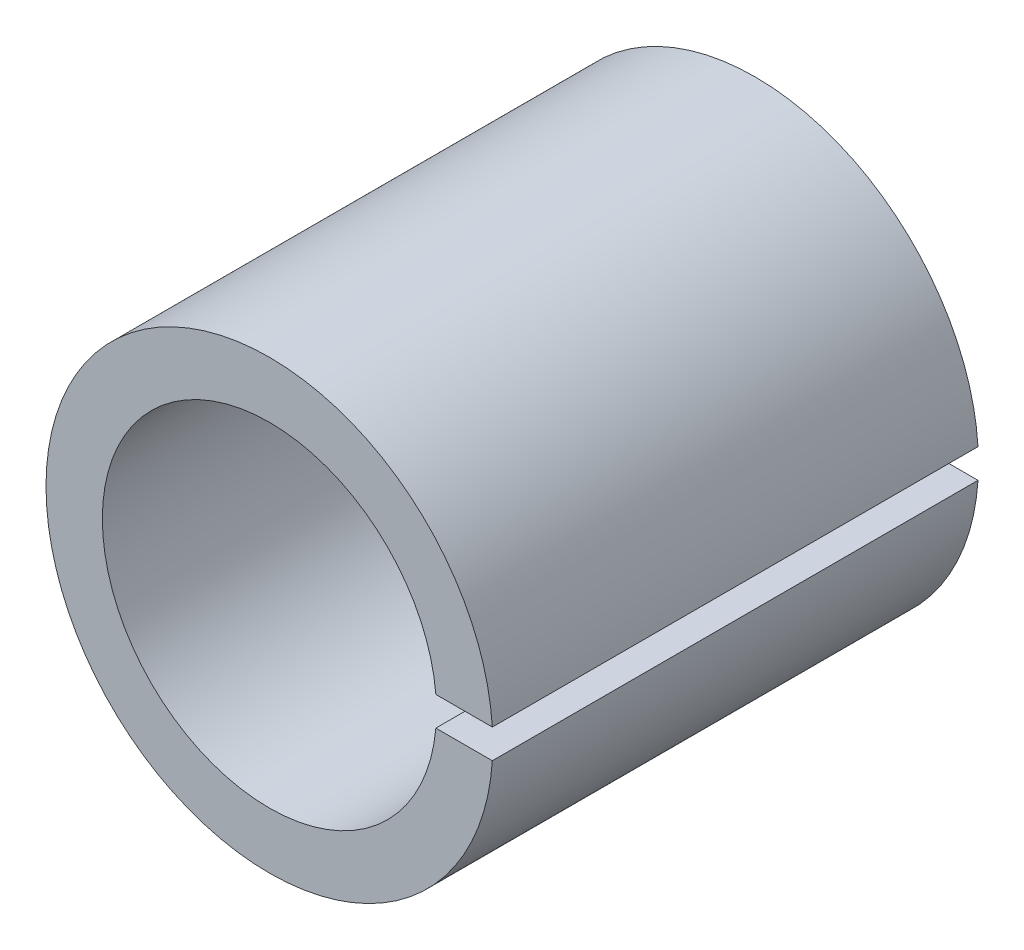
ISO-10303-21;
HEADER;
FILE_DESCRIPTION(('STEP AP214'),'2;1');
FILE_NAME('part.step','',(''),(''),'','','');
FILE_SCHEMA(('AUTOMOTIVE_DESIGN { 1 0 10303 214 1 1 1 1 }'));
ENDSEC;
DATA;
#1=APPLICATION_CONTEXT('core data for automotive mechanical design processes');
#2=APPLICATION_PROTOCOL_DEFINITION('international standard','automotive_design',2000,#1);
#3=PRODUCT_CONTEXT('',#1,'mechanical');
#4=PRODUCT('Part','Part','',(#3));
#5=PRODUCT_RELATED_PRODUCT_CATEGORY('part','',(#4));
#6=PRODUCT_DEFINITION_FORMATION('','',#4);
#7=PRODUCT_DEFINITION_CONTEXT('part definition',#1,'design');
#8=PRODUCT_DEFINITION('design','',#6,#7);
#9=PRODUCT_DEFINITION_SHAPE('','',#8);
#10=(LENGTH_UNIT() NAMED_UNIT(*) SI_UNIT(.MILLI.,.METRE.));
#11=(NAMED_UNIT(*) PLANE_ANGLE_UNIT() SI_UNIT($,.RADIAN.));
#12=(NAMED_UNIT(*) SI_UNIT($,.STERADIAN.) SOLID_ANGLE_UNIT());
#13=UNCERTAINTY_MEASURE_WITH_UNIT(LENGTH_MEASURE(1.E-05),#10,'distance_accuracy_value','');
#14=(GEOMETRIC_REPRESENTATION_CONTEXT(3) GLOBAL_UNCERTAINTY_ASSIGNED_CONTEXT((#13)) GLOBAL_UNIT_ASSIGNED_CONTEXT((#10,
#11,#12)) REPRESENTATION_CONTEXT('',''));
#15=CARTESIAN_POINT('',(0.,0.,0.));
#16=DIRECTION('',(0.,0.,1.));
#17=DIRECTION('',(1.,0.,0.));
#18=AXIS2_PLACEMENT_3D('',#15,#16,#17);
#19=CARTESIAN_POINT('',(0.,0.,3.175));
#20=DIRECTION('',(0.,0.,-1.));
#21=DIRECTION('',(-1.,0.,0.));
#22=AXIS2_PLACEMENT_3D('',#19,#20,#21);
#23=CYLINDRICAL_SURFACE('',#22,2.921);
#24=DIRECTION('',(0.,0.,-1.));
#25=VECTOR('',#24,1.);
#26=CARTESIAN_POINT('',(2.91478142405224,0.1905,3.175));
#27=LINE('',#26,#25);
#28=CARTESIAN_POINT('',(2.91478142405224,0.1905,3.175));
#29=VERTEX_POINT('',#28);
#30=CARTESIAN_POINT('',(2.91478142405224,0.1905,-3.175));
#31=VERTEX_POINT('',#30);
#32=EDGE_CURVE('E91',#29,#31,#27,.T.);
#33=ORIENTED_EDGE('',*,*,#32,.T.);
#34=CARTESIAN_POINT('',(0.,0.,-3.175));
#35=DIRECTION('',(0.,0.,1.));
#36=DIRECTION('',(1.,0.,0.));
#37=AXIS2_PLACEMENT_3D('',#34,#35,#36);
#38=CIRCLE('',#37,2.921);
#39=CARTESIAN_POINT('',(2.91478142405224,-0.1905,-3.175));
#40=VERTEX_POINT('',#39);
#41=EDGE_CURVE('E86',#31,#40,#38,.T.);
#42=ORIENTED_EDGE('',*,*,#41,.T.);
#43=DIRECTION('',(0.,0.,-1.));
#44=VECTOR('',#43,1.);
#45=CARTESIAN_POINT('',(2.91478142405224,-0.1905,3.175));
#46=LINE('',#45,#44);
#47=CARTESIAN_POINT('',(2.91478142405224,-0.1905,3.175));
#48=VERTEX_POINT('',#47);
#49=EDGE_CURVE('E11',#48,#40,#46,.T.);
#50=ORIENTED_EDGE('',*,*,#49,.F.);
#51=CARTESIAN_POINT('',(0.,0.,3.175));
#52=DIRECTION('',(0.,0.,1.));
#53=DIRECTION('',(1.,0.,0.));
#54=AXIS2_PLACEMENT_3D('',#51,#52,#53);
#55=CIRCLE('',#54,2.921);
#56=EDGE_CURVE('E97',#29,#48,#55,.T.);
#57=ORIENTED_EDGE('',*,*,#56,.F.);
#58=EDGE_LOOP('',(#33,#42,#50,#57));
#59=FACE_BOUND('',#58,.T.);
#60=ADVANCED_FACE('F34',(#59),#23,.T.);
#61=CARTESIAN_POINT('',(2.17607745955883,-0.1905,3.175));
#62=DIRECTION('',(0.,-1.,0.));
#63=DIRECTION('',(0.,0.,-1.));
#64=AXIS2_PLACEMENT_3D('',#61,#62,#63);
#65=PLANE('',#64);
#66=ORIENTED_EDGE('',*,*,#49,.T.);
#67=DIRECTION('',(-1.,0.,0.));
#68=VECTOR('',#67,1.);
#69=CARTESIAN_POINT('',(2.17607745955883,-0.1905,-3.175));
#70=LINE('',#69,#68);
#71=CARTESIAN_POINT('',(2.17607745955883,-0.1905,-3.175));
#72=VERTEX_POINT('',#71);
#73=EDGE_CURVE('E76',#40,#72,#70,.T.);
#74=ORIENTED_EDGE('',*,*,#73,.T.);
#75=DIRECTION('',(0.,0.,-1.));
#76=VECTOR('',#75,1.);
#77=CARTESIAN_POINT('',(2.17607745955883,-0.1905,3.175));
#78=LINE('',#77,#76);
#79=CARTESIAN_POINT('',(2.17607745955883,-0.1905,3.175));
#80=VERTEX_POINT('',#79);
#81=EDGE_CURVE('E41',#80,#72,#78,.T.);
#82=ORIENTED_EDGE('',*,*,#81,.F.);
#83=DIRECTION('',(-1.,0.,0.));
#84=VECTOR('',#83,1.);
#85=CARTESIAN_POINT('',(2.17607745955883,-0.1905,3.175));
#86=LINE('',#85,#84);
#87=EDGE_CURVE('E77',#48,#80,#86,.T.);
#88=ORIENTED_EDGE('',*,*,#87,.F.);
#89=EDGE_LOOP('',(#66,#74,#82,#88));
#90=FACE_BOUND('',#89,.T.);
#91=ADVANCED_FACE('F74',(#90),#65,.F.);
#92=CARTESIAN_POINT('',(0.,0.,3.175));
#93=DIRECTION('',(0.,0.,-1.));
#94=DIRECTION('',(-1.,0.,0.));
#95=AXIS2_PLACEMENT_3D('',#92,#93,#94);
#96=CYLINDRICAL_SURFACE('',#95,2.1844);
#97=ORIENTED_EDGE('',*,*,#81,.T.);
#98=CARTESIAN_POINT('',(0.,0.,-3.175));
#99=DIRECTION('',(0.,0.,-1.));
#100=DIRECTION('',(1.,0.,0.));
#101=AXIS2_PLACEMENT_3D('',#98,#99,#100);
#102=CIRCLE('',#101,2.1844);
#103=CARTESIAN_POINT('',(2.17607745955883,0.1905,-3.175));
#104=VERTEX_POINT('',#103);
#105=EDGE_CURVE('E89',#72,#104,#102,.T.);
#106=ORIENTED_EDGE('',*,*,#105,.T.);
#107=DIRECTION('',(0.,0.,-1.));
#108=VECTOR('',#107,1.);
#109=CARTESIAN_POINT('',(2.17607745955883,0.1905,3.175));
#110=LINE('',#109,#108);
#111=CARTESIAN_POINT('',(2.17607745955883,0.1905,3.175));
#112=VERTEX_POINT('',#111);
#113=EDGE_CURVE('E103',#112,#104,#110,.T.);
#114=ORIENTED_EDGE('',*,*,#113,.F.);
#115=CARTESIAN_POINT('',(0.,0.,3.175));
#116=DIRECTION('',(0.,0.,-1.));
#117=DIRECTION('',(1.,0.,0.));
#118=AXIS2_PLACEMENT_3D('',#115,#116,#117);
#119=CIRCLE('',#118,2.1844);
#120=EDGE_CURVE('E53',#80,#112,#119,.T.);
#121=ORIENTED_EDGE('',*,*,#120,.F.);
#122=EDGE_LOOP('',(#97,#106,#114,#121));
#123=FACE_BOUND('',#122,.T.);
#124=ADVANCED_FACE('F105',(#123),#96,.F.);
#125=CARTESIAN_POINT('',(2.17607745955883,0.1905,3.175));
#126=DIRECTION('',(0.,1.,0.));
#127=DIRECTION('',(0.,0.,1.));
#128=AXIS2_PLACEMENT_3D('',#125,#126,#127);
#129=PLANE('',#128);
#130=ORIENTED_EDGE('',*,*,#113,.T.);
#131=DIRECTION('',(1.,0.,0.));
#132=VECTOR('',#131,1.);
#133=CARTESIAN_POINT('',(2.17607745955883,0.1905,-3.175));
#134=LINE('',#133,#132);
#135=EDGE_CURVE('E95',#104,#31,#134,.T.);
#136=ORIENTED_EDGE('',*,*,#135,.T.);
#137=ORIENTED_EDGE('',*,*,#32,.F.);
#138=DIRECTION('',(1.,0.,0.));
#139=VECTOR('',#138,1.);
#140=CARTESIAN_POINT('',(2.17607745955883,0.1905,3.175));
#141=LINE('',#140,#139);
#142=EDGE_CURVE('E48',#112,#29,#141,.T.);
#143=ORIENTED_EDGE('',*,*,#142,.F.);
#144=EDGE_LOOP('',(#130,#136,#137,#143));
#145=FACE_BOUND('',#144,.T.);
#146=ADVANCED_FACE('F107',(#145),#129,.F.);
#147=CARTESIAN_POINT('',(0.,0.,3.175));
#148=DIRECTION('',(0.,0.,1.));
#149=DIRECTION('',(1.,0.,0.));
#150=AXIS2_PLACEMENT_3D('',#147,#148,#149);
#151=PLANE('',#150);
#152=ORIENTED_EDGE('',*,*,#56,.T.);
#153=ORIENTED_EDGE('',*,*,#87,.T.);
#154=ORIENTED_EDGE('',*,*,#120,.T.);
#155=ORIENTED_EDGE('',*,*,#142,.T.);
#156=EDGE_LOOP('',(#152,#153,#154,#155));
#157=FACE_BOUND('',#156,.T.);
#158=ADVANCED_FACE('F108',(#157),#151,.T.);
#159=CARTESIAN_POINT('',(0.,0.,-3.175));
#160=DIRECTION('',(0.,0.,1.));
#161=DIRECTION('',(1.,0.,0.));
#162=AXIS2_PLACEMENT_3D('',#159,#160,#161);
#163=PLANE('',#162);
#164=ORIENTED_EDGE('',*,*,#41,.F.);
#165=ORIENTED_EDGE('',*,*,#135,.F.);
#166=ORIENTED_EDGE('',*,*,#105,.F.);
#167=ORIENTED_EDGE('',*,*,#73,.F.);
#168=EDGE_LOOP('',(#164,#165,#166,#167));
#169=FACE_BOUND('',#168,.T.);
#170=ADVANCED_FACE('F84',(#169),#163,.F.);
#171=CLOSED_SHELL('',(#60,#91,#124,#146,#158,#170));
#172=MANIFOLD_SOLID_BREP('B2',#171);
#173=ADVANCED_BREP_SHAPE_REPRESENTATION('',(#18,#172),#14);
#174=SHAPE_DEFINITION_REPRESENTATION(#9,#173);
ENDSEC;
END-ISO-10303-21;
